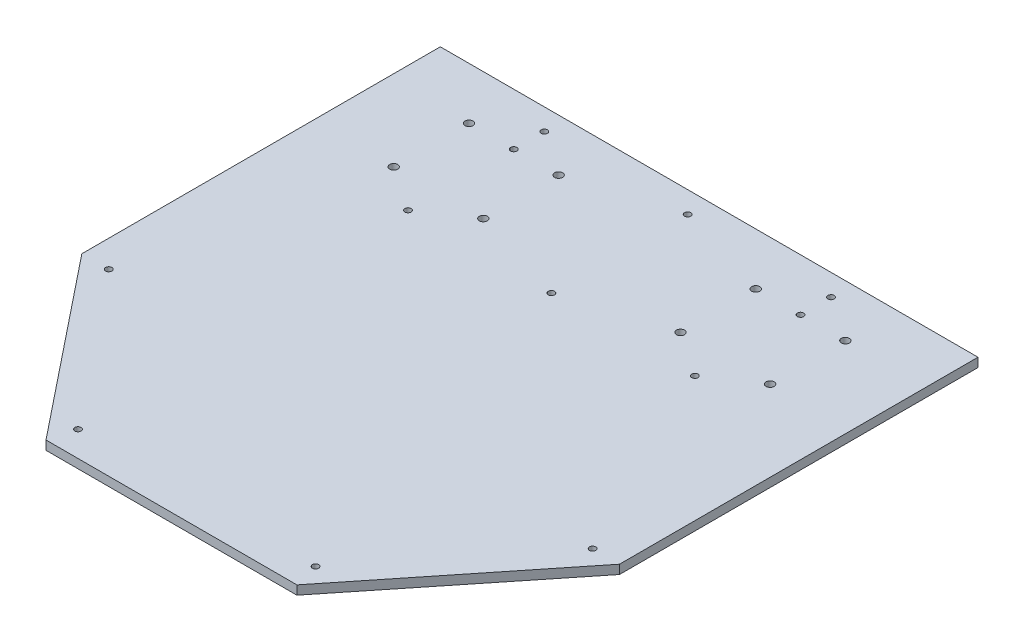
ISO-10303-21;
HEADER;
FILE_DESCRIPTION(('STEP AP214'),'2;1');
FILE_NAME('part.step','',(''),(''),'','','');
FILE_SCHEMA(('AUTOMOTIVE_DESIGN { 1 0 10303 214 1 1 1 1 }'));
ENDSEC;
DATA;
#1=APPLICATION_CONTEXT('core data for automotive mechanical design processes');
#2=APPLICATION_PROTOCOL_DEFINITION('international standard','automotive_design',2000,#1);
#3=PRODUCT_CONTEXT('',#1,'mechanical');
#4=PRODUCT('Part','Part','',(#3));
#5=PRODUCT_RELATED_PRODUCT_CATEGORY('part','',(#4));
#6=PRODUCT_DEFINITION_FORMATION('','',#4);
#7=PRODUCT_DEFINITION_CONTEXT('part definition',#1,'design');
#8=PRODUCT_DEFINITION('design','',#6,#7);
#9=PRODUCT_DEFINITION_SHAPE('','',#8);
#10=(LENGTH_UNIT() NAMED_UNIT(*) SI_UNIT(.MILLI.,.METRE.));
#11=(NAMED_UNIT(*) PLANE_ANGLE_UNIT() SI_UNIT($,.RADIAN.));
#12=(NAMED_UNIT(*) SI_UNIT($,.STERADIAN.) SOLID_ANGLE_UNIT());
#13=UNCERTAINTY_MEASURE_WITH_UNIT(LENGTH_MEASURE(1.E-05),#10,'distance_accuracy_value','');
#14=(GEOMETRIC_REPRESENTATION_CONTEXT(3) GLOBAL_UNCERTAINTY_ASSIGNED_CONTEXT((#13)) GLOBAL_UNIT_ASSIGNED_CONTEXT((#10,
#11,#12)) REPRESENTATION_CONTEXT('',''));
#15=CARTESIAN_POINT('',(0.,0.,0.));
#16=DIRECTION('',(0.,0.,1.));
#17=DIRECTION('',(1.,0.,0.));
#18=AXIS2_PLACEMENT_3D('',#15,#16,#17);
#19=CARTESIAN_POINT('',(0.,5.,0.));
#20=DIRECTION('',(0.,1.,0.));
#21=DIRECTION('',(0.,0.,1.));
#22=AXIS2_PLACEMENT_3D('',#19,#20,#21);
#23=PLANE('',#22);
#24=CARTESIAN_POINT('',(66.2835447690133,5.,135.895569038733));
#25=DIRECTION('',(0.,1.,0.));
#26=DIRECTION('',(0.,0.,-1.));
#27=AXIS2_PLACEMENT_3D('',#24,#25,#26);
#28=CIRCLE('',#27,1.75000000000001);
#29=CARTESIAN_POINT('',(66.2835447690133,5.,134.145569038733));
#30=VERTEX_POINT('',#29);
#31=EDGE_CURVE('E265',#30,#30,#28,.T.);
#32=ORIENTED_EDGE('',*,*,#31,.F.);
#33=EDGE_LOOP('',(#32));
#34=FACE_BOUND('',#33,.T.);
#35=CARTESIAN_POINT('',(135.,5.,49.9999999999999));
#36=DIRECTION('',(0.,1.,0.));
#37=DIRECTION('',(0.,0.,-1.));
#38=AXIS2_PLACEMENT_3D('',#35,#36,#37);
#39=CIRCLE('',#38,1.75000000000001);
#40=CARTESIAN_POINT('',(135.,5.,48.2499999999999));
#41=VERTEX_POINT('',#40);
#42=EDGE_CURVE('E257',#41,#41,#39,.T.);
#43=ORIENTED_EDGE('',*,*,#42,.F.);
#44=EDGE_LOOP('',(#43));
#45=FACE_BOUND('',#44,.T.);
#46=CARTESIAN_POINT('',(-66.2835447690133,5.,135.895569038733));
#47=DIRECTION('',(0.,1.,0.));
#48=DIRECTION('',(0.,0.,1.));
#49=AXIS2_PLACEMENT_3D('',#46,#47,#48);
#50=CIRCLE('',#49,1.75000000000001);
#51=CARTESIAN_POINT('',(-66.2835447690133,5.,137.645569038733));
#52=VERTEX_POINT('',#51);
#53=EDGE_CURVE('E250',#52,#52,#50,.T.);
#54=ORIENTED_EDGE('',*,*,#53,.F.);
#55=EDGE_LOOP('',(#54));
#56=FACE_BOUND('',#55,.T.);
#57=CARTESIAN_POINT('',(-135.,5.,50.));
#58=DIRECTION('',(0.,1.,0.));
#59=DIRECTION('',(0.,0.,1.));
#60=AXIS2_PLACEMENT_3D('',#57,#58,#59);
#61=CIRCLE('',#60,1.75000000000001);
#62=CARTESIAN_POINT('',(-135.,5.,51.75));
#63=VERTEX_POINT('',#62);
#64=EDGE_CURVE('E254',#63,#63,#61,.T.);
#65=ORIENTED_EDGE('',*,*,#64,.F.);
#66=EDGE_LOOP('',(#65));
#67=FACE_BOUND('',#66,.T.);
#68=CARTESIAN_POINT('',(80.,5.,-121.));
#69=DIRECTION('',(0.,1.,0.));
#70=DIRECTION('',(0.,0.,-1.));
#71=AXIS2_PLACEMENT_3D('',#68,#69,#70);
#72=CIRCLE('',#71,1.75);
#73=CARTESIAN_POINT('',(80.,5.,-122.75));
#74=VERTEX_POINT('',#73);
#75=EDGE_CURVE('E272',#74,#74,#72,.T.);
#76=ORIENTED_EDGE('',*,*,#75,.F.);
#77=EDGE_LOOP('',(#76));
#78=FACE_BOUND('',#77,.T.);
#79=CARTESIAN_POINT('',(-80.,5.,-121.));
#80=DIRECTION('',(0.,1.,0.));
#81=DIRECTION('',(0.,0.,1.));
#82=AXIS2_PLACEMENT_3D('',#79,#80,#81);
#83=CIRCLE('',#82,1.75);
#84=CARTESIAN_POINT('',(-80.,5.,-119.25));
#85=VERTEX_POINT('',#84);
#86=EDGE_CURVE('E271',#85,#85,#83,.T.);
#87=ORIENTED_EDGE('',*,*,#86,.F.);
#88=EDGE_LOOP('',(#87));
#89=FACE_BOUND('',#88,.T.);
#90=CARTESIAN_POINT('',(-80.,5.,-62.));
#91=DIRECTION('',(0.,1.,0.));
#92=DIRECTION('',(0.,0.,1.));
#93=AXIS2_PLACEMENT_3D('',#90,#91,#92);
#94=CIRCLE('',#93,1.75);
#95=CARTESIAN_POINT('',(-80.,5.,-60.25));
#96=VERTEX_POINT('',#95);
#97=EDGE_CURVE('E290',#96,#96,#94,.T.);
#98=ORIENTED_EDGE('',*,*,#97,.F.);
#99=EDGE_LOOP('',(#98));
#100=FACE_BOUND('',#99,.T.);
#101=CARTESIAN_POINT('',(80.,5.,-62.));
#102=DIRECTION('',(0.,1.,0.));
#103=DIRECTION('',(0.,0.,-1.));
#104=AXIS2_PLACEMENT_3D('',#101,#102,#103);
#105=CIRCLE('',#104,1.75);
#106=CARTESIAN_POINT('',(80.,5.,-63.75));
#107=VERTEX_POINT('',#106);
#108=EDGE_CURVE('E296',#107,#107,#105,.T.);
#109=ORIENTED_EDGE('',*,*,#108,.F.);
#110=EDGE_LOOP('',(#109));
#111=FACE_BOUND('',#110,.T.);
#112=CARTESIAN_POINT('',(80.,5.,-138.));
#113=DIRECTION('',(0.,1.,0.));
#114=DIRECTION('',(0.,0.,1.));
#115=AXIS2_PLACEMENT_3D('',#112,#113,#114);
#116=CIRCLE('',#115,1.75);
#117=CARTESIAN_POINT('',(80.,5.,-136.25));
#118=VERTEX_POINT('',#117);
#119=EDGE_CURVE('E302',#118,#118,#116,.T.);
#120=ORIENTED_EDGE('',*,*,#119,.F.);
#121=EDGE_LOOP('',(#120));
#122=FACE_BOUND('',#121,.T.);
#123=CARTESIAN_POINT('',(-80.,5.,-138.));
#124=DIRECTION('',(0.,1.,0.));
#125=DIRECTION('',(0.,0.,-1.));
#126=AXIS2_PLACEMENT_3D('',#123,#124,#125);
#127=CIRCLE('',#126,1.75);
#128=CARTESIAN_POINT('',(-80.,5.,-139.75));
#129=VERTEX_POINT('',#128);
#130=EDGE_CURVE('E308',#129,#129,#127,.T.);
#131=ORIENTED_EDGE('',*,*,#130,.F.);
#132=EDGE_LOOP('',(#131));
#133=FACE_BOUND('',#132,.T.);
#134=CARTESIAN_POINT('',(0.,5.,-138.));
#135=DIRECTION('',(0.,1.,0.));
#136=DIRECTION('',(0.,0.,-1.));
#137=AXIS2_PLACEMENT_3D('',#134,#135,#136);
#138=CIRCLE('',#137,1.75);
#139=CARTESIAN_POINT('',(0.,5.,-139.75));
#140=VERTEX_POINT('',#139);
#141=EDGE_CURVE('E283',#140,#140,#138,.T.);
#142=ORIENTED_EDGE('',*,*,#141,.F.);
#143=EDGE_LOOP('',(#142));
#144=FACE_BOUND('',#143,.T.);
#145=CARTESIAN_POINT('',(0.,5.,-62.));
#146=DIRECTION('',(0.,1.,0.));
#147=DIRECTION('',(0.,0.,1.));
#148=AXIS2_PLACEMENT_3D('',#145,#146,#147);
#149=CIRCLE('',#148,1.75);
#150=CARTESIAN_POINT('',(0.,5.,-60.25));
#151=VERTEX_POINT('',#150);
#152=EDGE_CURVE('E289',#151,#151,#149,.T.);
#153=ORIENTED_EDGE('',*,*,#152,.F.);
#154=EDGE_LOOP('',(#153));
#155=FACE_BOUND('',#154,.T.);
#156=CARTESIAN_POINT('',(105.,5.,-121.));
#157=DIRECTION('',(0.,1.,0.));
#158=DIRECTION('',(0.,0.,1.));
#159=AXIS2_PLACEMENT_3D('',#156,#157,#158);
#160=CIRCLE('',#159,2.25000000000001);
#161=CARTESIAN_POINT('',(105.,5.,-118.75));
#162=VERTEX_POINT('',#161);
#163=EDGE_CURVE('E328',#162,#162,#160,.T.);
#164=ORIENTED_EDGE('',*,*,#163,.F.);
#165=EDGE_LOOP('',(#164));
#166=FACE_BOUND('',#165,.T.);
#167=CARTESIAN_POINT('',(55.,5.,-121.));
#168=DIRECTION('',(0.,1.,0.));
#169=DIRECTION('',(0.,0.,1.));
#170=AXIS2_PLACEMENT_3D('',#167,#168,#169);
#171=CIRCLE('',#170,2.25);
#172=CARTESIAN_POINT('',(55.,5.,-118.75));
#173=VERTEX_POINT('',#172);
#174=EDGE_CURVE('E340',#173,#173,#171,.T.);
#175=ORIENTED_EDGE('',*,*,#174,.F.);
#176=EDGE_LOOP('',(#175));
#177=FACE_BOUND('',#176,.T.);
#178=CARTESIAN_POINT('',(-55.,5.,-79.));
#179=DIRECTION('',(0.,1.,0.));
#180=DIRECTION('',(0.,0.,1.));
#181=AXIS2_PLACEMENT_3D('',#178,#179,#180);
#182=CIRCLE('',#181,2.25);
#183=CARTESIAN_POINT('',(-55.,5.,-76.75));
#184=VERTEX_POINT('',#183);
#185=EDGE_CURVE('E352',#184,#184,#182,.T.);
#186=ORIENTED_EDGE('',*,*,#185,.F.);
#187=EDGE_LOOP('',(#186));
#188=FACE_BOUND('',#187,.T.);
#189=CARTESIAN_POINT('',(-105.,5.,-121.));
#190=DIRECTION('',(0.,1.,0.));
#191=DIRECTION('',(0.,0.,1.));
#192=AXIS2_PLACEMENT_3D('',#189,#190,#191);
#193=CIRCLE('',#192,2.25000000000001);
#194=CARTESIAN_POINT('',(-105.,5.,-118.75));
#195=VERTEX_POINT('',#194);
#196=EDGE_CURVE('E124',#195,#195,#193,.T.);
#197=ORIENTED_EDGE('',*,*,#196,.F.);
#198=EDGE_LOOP('',(#197));
#199=FACE_BOUND('',#198,.T.);
#200=DIRECTION('',(0.,0.,1.));
#201=VECTOR('',#200,1.);
#202=CARTESIAN_POINT('',(-150.,5.,-150.));
#203=LINE('',#202,#201);
#204=CARTESIAN_POINT('',(-150.,5.,-150.));
#205=VERTEX_POINT('',#204);
#206=CARTESIAN_POINT('',(-150.,5.,50.));
#207=VERTEX_POINT('',#206);
#208=EDGE_CURVE('E131',#205,#207,#203,.T.);
#209=ORIENTED_EDGE('',*,*,#208,.T.);
#210=DIRECTION('',(0.624695047554425,0.,0.78086880944303));
#211=VECTOR('',#210,1.);
#212=CARTESIAN_POINT('',(-150.,5.,50.));
#213=LINE('',#212,#211);
#214=CARTESIAN_POINT('',(-70.,5.,150.));
#215=VERTEX_POINT('',#214);
#216=EDGE_CURVE('E89',#207,#215,#213,.T.);
#217=ORIENTED_EDGE('',*,*,#216,.T.);
#218=DIRECTION('',(1.,0.,0.));
#219=VECTOR('',#218,1.);
#220=CARTESIAN_POINT('',(-70.,5.,150.));
#221=LINE('',#220,#219);
#222=CARTESIAN_POINT('',(70.,5.,150.));
#223=VERTEX_POINT('',#222);
#224=EDGE_CURVE('E102',#215,#223,#221,.T.);
#225=ORIENTED_EDGE('',*,*,#224,.T.);
#226=DIRECTION('',(0.624695047554424,0.,-0.78086880944303));
#227=VECTOR('',#226,1.);
#228=CARTESIAN_POINT('',(150.,5.,50.));
#229=LINE('',#228,#227);
#230=CARTESIAN_POINT('',(150.,5.,50.));
#231=VERTEX_POINT('',#230);
#232=EDGE_CURVE('E96',#223,#231,#229,.T.);
#233=ORIENTED_EDGE('',*,*,#232,.T.);
#234=DIRECTION('',(0.,0.,-1.));
#235=VECTOR('',#234,1.);
#236=CARTESIAN_POINT('',(150.,5.,-150.));
#237=LINE('',#236,#235);
#238=CARTESIAN_POINT('',(150.,5.,-150.));
#239=VERTEX_POINT('',#238);
#240=EDGE_CURVE('E100',#231,#239,#237,.T.);
#241=ORIENTED_EDGE('',*,*,#240,.T.);
#242=DIRECTION('',(-1.,0.,0.));
#243=VECTOR('',#242,1.);
#244=CARTESIAN_POINT('',(-150.,5.,-150.));
#245=LINE('',#244,#243);
#246=EDGE_CURVE('E52',#239,#205,#245,.T.);
#247=ORIENTED_EDGE('',*,*,#246,.T.);
#248=EDGE_LOOP('',(#209,#217,#225,#233,#241,#247));
#249=FACE_BOUND('',#248,.T.);
#250=CARTESIAN_POINT('',(-105.,5.,-79.));
#251=DIRECTION('',(0.,1.,0.));
#252=DIRECTION('',(0.,0.,1.));
#253=AXIS2_PLACEMENT_3D('',#250,#251,#252);
#254=CIRCLE('',#253,2.25000000000001);
#255=CARTESIAN_POINT('',(-105.,5.,-76.7499999999999));
#256=VERTEX_POINT('',#255);
#257=EDGE_CURVE('E358',#256,#256,#254,.T.);
#258=ORIENTED_EDGE('',*,*,#257,.F.);
#259=EDGE_LOOP('',(#258));
#260=FACE_BOUND('',#259,.T.);
#261=CARTESIAN_POINT('',(-55.,5.,-121.));
#262=DIRECTION('',(0.,1.,0.));
#263=DIRECTION('',(0.,0.,1.));
#264=AXIS2_PLACEMENT_3D('',#261,#262,#263);
#265=CIRCLE('',#264,2.25);
#266=CARTESIAN_POINT('',(-55.,5.,-118.75));
#267=VERTEX_POINT('',#266);
#268=EDGE_CURVE('E346',#267,#267,#265,.T.);
#269=ORIENTED_EDGE('',*,*,#268,.F.);
#270=EDGE_LOOP('',(#269));
#271=FACE_BOUND('',#270,.T.);
#272=CARTESIAN_POINT('',(55.,5.,-79.));
#273=DIRECTION('',(0.,1.,0.));
#274=DIRECTION('',(0.,0.,1.));
#275=AXIS2_PLACEMENT_3D('',#272,#273,#274);
#276=CIRCLE('',#275,2.25);
#277=CARTESIAN_POINT('',(55.,5.,-76.75));
#278=VERTEX_POINT('',#277);
#279=EDGE_CURVE('E334',#278,#278,#276,.T.);
#280=ORIENTED_EDGE('',*,*,#279,.F.);
#281=EDGE_LOOP('',(#280));
#282=FACE_BOUND('',#281,.T.);
#283=CARTESIAN_POINT('',(105.,5.,-79.));
#284=DIRECTION('',(0.,1.,0.));
#285=DIRECTION('',(0.,0.,1.));
#286=AXIS2_PLACEMENT_3D('',#283,#284,#285);
#287=CIRCLE('',#286,2.25000000000001);
#288=CARTESIAN_POINT('',(105.,5.,-76.75));
#289=VERTEX_POINT('',#288);
#290=EDGE_CURVE('E322',#289,#289,#287,.T.);
#291=ORIENTED_EDGE('',*,*,#290,.F.);
#292=EDGE_LOOP('',(#291));
#293=FACE_BOUND('',#292,.T.);
#294=ADVANCED_FACE('F35',(#34,#45,#56,#67,#78,#89,#100,#111,#122,#133,#144,#155,#166,#177,#188,
#199,#249,#260,#271,#282,#293),#23,.T.);
#295=CARTESIAN_POINT('',(0.,0.,0.));
#296=DIRECTION('',(0.,1.,0.));
#297=DIRECTION('',(0.,0.,1.));
#298=AXIS2_PLACEMENT_3D('',#295,#296,#297);
#299=PLANE('',#298);
#300=CARTESIAN_POINT('',(66.2835447690133,0.,135.895569038733));
#301=DIRECTION('',(0.,1.,0.));
#302=DIRECTION('',(0.,0.,-1.));
#303=AXIS2_PLACEMENT_3D('',#300,#301,#302);
#304=CIRCLE('',#303,1.75000000000001);
#305=CARTESIAN_POINT('',(66.2835447690133,0.,134.145569038733));
#306=VERTEX_POINT('',#305);
#307=EDGE_CURVE('E262',#306,#306,#304,.T.);
#308=ORIENTED_EDGE('',*,*,#307,.T.);
#309=EDGE_LOOP('',(#308));
#310=FACE_BOUND('',#309,.T.);
#311=CARTESIAN_POINT('',(135.,0.,49.9999999999999));
#312=DIRECTION('',(0.,1.,0.));
#313=DIRECTION('',(0.,0.,-1.));
#314=AXIS2_PLACEMENT_3D('',#311,#312,#313);
#315=CIRCLE('',#314,1.75000000000001);
#316=CARTESIAN_POINT('',(135.,0.,48.2499999999999));
#317=VERTEX_POINT('',#316);
#318=EDGE_CURVE('E252',#317,#317,#315,.T.);
#319=ORIENTED_EDGE('',*,*,#318,.T.);
#320=EDGE_LOOP('',(#319));
#321=FACE_BOUND('',#320,.T.);
#322=CARTESIAN_POINT('',(-66.2835447690133,0.,135.895569038733));
#323=DIRECTION('',(0.,1.,0.));
#324=DIRECTION('',(0.,0.,1.));
#325=AXIS2_PLACEMENT_3D('',#322,#323,#324);
#326=CIRCLE('',#325,1.75000000000001);
#327=CARTESIAN_POINT('',(-66.2835447690133,0.,137.645569038733));
#328=VERTEX_POINT('',#327);
#329=EDGE_CURVE('E247',#328,#328,#326,.T.);
#330=ORIENTED_EDGE('',*,*,#329,.T.);
#331=EDGE_LOOP('',(#330));
#332=FACE_BOUND('',#331,.T.);
#333=CARTESIAN_POINT('',(-135.,0.,50.));
#334=DIRECTION('',(0.,1.,0.));
#335=DIRECTION('',(0.,0.,1.));
#336=AXIS2_PLACEMENT_3D('',#333,#334,#335);
#337=CIRCLE('',#336,1.75000000000001);
#338=CARTESIAN_POINT('',(-135.,0.,51.75));
#339=VERTEX_POINT('',#338);
#340=EDGE_CURVE('E275',#339,#339,#337,.T.);
#341=ORIENTED_EDGE('',*,*,#340,.T.);
#342=EDGE_LOOP('',(#341));
#343=FACE_BOUND('',#342,.T.);
#344=CARTESIAN_POINT('',(80.,0.,-121.));
#345=DIRECTION('',(0.,1.,0.));
#346=DIRECTION('',(0.,0.,-1.));
#347=AXIS2_PLACEMENT_3D('',#344,#345,#346);
#348=CIRCLE('',#347,1.75);
#349=CARTESIAN_POINT('',(80.,0.,-122.75));
#350=VERTEX_POINT('',#349);
#351=EDGE_CURVE('E268',#350,#350,#348,.T.);
#352=ORIENTED_EDGE('',*,*,#351,.T.);
#353=EDGE_LOOP('',(#352));
#354=FACE_BOUND('',#353,.T.);
#355=CARTESIAN_POINT('',(-80.,0.,-121.));
#356=DIRECTION('',(0.,1.,0.));
#357=DIRECTION('',(0.,0.,1.));
#358=AXIS2_PLACEMENT_3D('',#355,#356,#357);
#359=CIRCLE('',#358,1.75);
#360=CARTESIAN_POINT('',(-80.,0.,-119.25));
#361=VERTEX_POINT('',#360);
#362=EDGE_CURVE('E280',#361,#361,#359,.T.);
#363=ORIENTED_EDGE('',*,*,#362,.T.);
#364=EDGE_LOOP('',(#363));
#365=FACE_BOUND('',#364,.T.);
#366=CARTESIAN_POINT('',(-80.,0.,-62.));
#367=DIRECTION('',(0.,1.,0.));
#368=DIRECTION('',(0.,0.,1.));
#369=AXIS2_PLACEMENT_3D('',#366,#367,#368);
#370=CIRCLE('',#369,1.75);
#371=CARTESIAN_POINT('',(-80.,0.,-60.25));
#372=VERTEX_POINT('',#371);
#373=EDGE_CURVE('E286',#372,#372,#370,.T.);
#374=ORIENTED_EDGE('',*,*,#373,.T.);
#375=EDGE_LOOP('',(#374));
#376=FACE_BOUND('',#375,.T.);
#377=CARTESIAN_POINT('',(80.,0.,-62.));
#378=DIRECTION('',(0.,1.,0.));
#379=DIRECTION('',(0.,0.,-1.));
#380=AXIS2_PLACEMENT_3D('',#377,#378,#379);
#381=CIRCLE('',#380,1.75);
#382=CARTESIAN_POINT('',(80.,0.,-63.75));
#383=VERTEX_POINT('',#382);
#384=EDGE_CURVE('E293',#383,#383,#381,.T.);
#385=ORIENTED_EDGE('',*,*,#384,.T.);
#386=EDGE_LOOP('',(#385));
#387=FACE_BOUND('',#386,.T.);
#388=CARTESIAN_POINT('',(80.,0.,-138.));
#389=DIRECTION('',(0.,1.,0.));
#390=DIRECTION('',(0.,0.,1.));
#391=AXIS2_PLACEMENT_3D('',#388,#389,#390);
#392=CIRCLE('',#391,1.75);
#393=CARTESIAN_POINT('',(80.,0.,-136.25));
#394=VERTEX_POINT('',#393);
#395=EDGE_CURVE('E299',#394,#394,#392,.T.);
#396=ORIENTED_EDGE('',*,*,#395,.T.);
#397=EDGE_LOOP('',(#396));
#398=FACE_BOUND('',#397,.T.);
#399=CARTESIAN_POINT('',(-80.,0.,-138.));
#400=DIRECTION('',(0.,1.,0.));
#401=DIRECTION('',(0.,0.,-1.));
#402=AXIS2_PLACEMENT_3D('',#399,#400,#401);
#403=CIRCLE('',#402,1.75);
#404=CARTESIAN_POINT('',(-80.,0.,-139.75));
#405=VERTEX_POINT('',#404);
#406=EDGE_CURVE('E305',#405,#405,#403,.T.);
#407=ORIENTED_EDGE('',*,*,#406,.T.);
#408=EDGE_LOOP('',(#407));
#409=FACE_BOUND('',#408,.T.);
#410=CARTESIAN_POINT('',(0.,0.,-138.));
#411=DIRECTION('',(0.,1.,0.));
#412=DIRECTION('',(0.,0.,-1.));
#413=AXIS2_PLACEMENT_3D('',#410,#411,#412);
#414=CIRCLE('',#413,1.75);
#415=CARTESIAN_POINT('',(0.,0.,-139.75));
#416=VERTEX_POINT('',#415);
#417=EDGE_CURVE('E311',#416,#416,#414,.T.);
#418=ORIENTED_EDGE('',*,*,#417,.T.);
#419=EDGE_LOOP('',(#418));
#420=FACE_BOUND('',#419,.T.);
#421=CARTESIAN_POINT('',(0.,0.,-62.));
#422=DIRECTION('',(0.,1.,0.));
#423=DIRECTION('',(0.,0.,1.));
#424=AXIS2_PLACEMENT_3D('',#421,#422,#423);
#425=CIRCLE('',#424,1.75);
#426=CARTESIAN_POINT('',(0.,0.,-60.25));
#427=VERTEX_POINT('',#426);
#428=EDGE_CURVE('E316',#427,#427,#425,.T.);
#429=ORIENTED_EDGE('',*,*,#428,.T.);
#430=EDGE_LOOP('',(#429));
#431=FACE_BOUND('',#430,.T.);
#432=DIRECTION('',(0.,0.,1.));
#433=VECTOR('',#432,1.);
#434=CARTESIAN_POINT('',(-150.,0.,-150.));
#435=LINE('',#434,#433);
#436=CARTESIAN_POINT('',(-150.,0.,-150.));
#437=VERTEX_POINT('',#436);
#438=CARTESIAN_POINT('',(-150.,0.,50.));
#439=VERTEX_POINT('',#438);
#440=EDGE_CURVE('E120',#437,#439,#435,.T.);
#441=ORIENTED_EDGE('',*,*,#440,.F.);
#442=DIRECTION('',(-1.,0.,0.));
#443=VECTOR('',#442,1.);
#444=CARTESIAN_POINT('',(-150.,0.,-150.));
#445=LINE('',#444,#443);
#446=CARTESIAN_POINT('',(150.,0.,-150.));
#447=VERTEX_POINT('',#446);
#448=EDGE_CURVE('E81',#447,#437,#445,.T.);
#449=ORIENTED_EDGE('',*,*,#448,.F.);
#450=DIRECTION('',(0.,0.,-1.));
#451=VECTOR('',#450,1.);
#452=CARTESIAN_POINT('',(150.,0.,-150.));
#453=LINE('',#452,#451);
#454=CARTESIAN_POINT('',(150.,0.,50.));
#455=VERTEX_POINT('',#454);
#456=EDGE_CURVE('E75',#455,#447,#453,.T.);
#457=ORIENTED_EDGE('',*,*,#456,.F.);
#458=DIRECTION('',(0.624695047554424,0.,-0.78086880944303));
#459=VECTOR('',#458,1.);
#460=CARTESIAN_POINT('',(150.,0.,50.));
#461=LINE('',#460,#459);
#462=CARTESIAN_POINT('',(70.,0.,150.));
#463=VERTEX_POINT('',#462);
#464=EDGE_CURVE('E110',#463,#455,#461,.T.);
#465=ORIENTED_EDGE('',*,*,#464,.F.);
#466=DIRECTION('',(1.,0.,0.));
#467=VECTOR('',#466,1.);
#468=CARTESIAN_POINT('',(-70.,0.,150.));
#469=LINE('',#468,#467);
#470=CARTESIAN_POINT('',(-70.,0.,150.));
#471=VERTEX_POINT('',#470);
#472=EDGE_CURVE('E126',#471,#463,#469,.T.);
#473=ORIENTED_EDGE('',*,*,#472,.F.);
#474=DIRECTION('',(0.624695047554425,0.,0.78086880944303));
#475=VECTOR('',#474,1.);
#476=CARTESIAN_POINT('',(-150.,0.,50.));
#477=LINE('',#476,#475);
#478=EDGE_CURVE('E123',#439,#471,#477,.T.);
#479=ORIENTED_EDGE('',*,*,#478,.F.);
#480=EDGE_LOOP('',(#441,#449,#457,#465,#473,#479));
#481=FACE_BOUND('',#480,.T.);
#482=CARTESIAN_POINT('',(-105.,0.,-121.));
#483=DIRECTION('',(0.,1.,0.));
#484=DIRECTION('',(0.,0.,1.));
#485=AXIS2_PLACEMENT_3D('',#482,#483,#484);
#486=CIRCLE('',#485,2.25000000000001);
#487=CARTESIAN_POINT('',(-105.,0.,-118.75));
#488=VERTEX_POINT('',#487);
#489=EDGE_CURVE('E361',#488,#488,#486,.T.);
#490=ORIENTED_EDGE('',*,*,#489,.T.);
#491=EDGE_LOOP('',(#490));
#492=FACE_BOUND('',#491,.T.);
#493=CARTESIAN_POINT('',(-105.,0.,-79.));
#494=DIRECTION('',(0.,1.,0.));
#495=DIRECTION('',(0.,0.,1.));
#496=AXIS2_PLACEMENT_3D('',#493,#494,#495);
#497=CIRCLE('',#496,2.25000000000001);
#498=CARTESIAN_POINT('',(-105.,0.,-76.7499999999999));
#499=VERTEX_POINT('',#498);
#500=EDGE_CURVE('E355',#499,#499,#497,.T.);
#501=ORIENTED_EDGE('',*,*,#500,.T.);
#502=EDGE_LOOP('',(#501));
#503=FACE_BOUND('',#502,.T.);
#504=CARTESIAN_POINT('',(-55.,0.,-79.));
#505=DIRECTION('',(0.,1.,0.));
#506=DIRECTION('',(0.,0.,1.));
#507=AXIS2_PLACEMENT_3D('',#504,#505,#506);
#508=CIRCLE('',#507,2.25);
#509=CARTESIAN_POINT('',(-55.,0.,-76.75));
#510=VERTEX_POINT('',#509);
#511=EDGE_CURVE('E349',#510,#510,#508,.T.);
#512=ORIENTED_EDGE('',*,*,#511,.T.);
#513=EDGE_LOOP('',(#512));
#514=FACE_BOUND('',#513,.T.);
#515=CARTESIAN_POINT('',(-55.,0.,-121.));
#516=DIRECTION('',(0.,1.,0.));
#517=DIRECTION('',(0.,0.,1.));
#518=AXIS2_PLACEMENT_3D('',#515,#516,#517);
#519=CIRCLE('',#518,2.25);
#520=CARTESIAN_POINT('',(-55.,0.,-118.75));
#521=VERTEX_POINT('',#520);
#522=EDGE_CURVE('E343',#521,#521,#519,.T.);
#523=ORIENTED_EDGE('',*,*,#522,.T.);
#524=EDGE_LOOP('',(#523));
#525=FACE_BOUND('',#524,.T.);
#526=CARTESIAN_POINT('',(55.,0.,-121.));
#527=DIRECTION('',(0.,1.,0.));
#528=DIRECTION('',(0.,0.,1.));
#529=AXIS2_PLACEMENT_3D('',#526,#527,#528);
#530=CIRCLE('',#529,2.25);
#531=CARTESIAN_POINT('',(55.,0.,-118.75));
#532=VERTEX_POINT('',#531);
#533=EDGE_CURVE('E337',#532,#532,#530,.T.);
#534=ORIENTED_EDGE('',*,*,#533,.T.);
#535=EDGE_LOOP('',(#534));
#536=FACE_BOUND('',#535,.T.);
#537=CARTESIAN_POINT('',(55.,0.,-79.));
#538=DIRECTION('',(0.,1.,0.));
#539=DIRECTION('',(0.,0.,1.));
#540=AXIS2_PLACEMENT_3D('',#537,#538,#539);
#541=CIRCLE('',#540,2.25);
#542=CARTESIAN_POINT('',(55.,0.,-76.75));
#543=VERTEX_POINT('',#542);
#544=EDGE_CURVE('E331',#543,#543,#541,.T.);
#545=ORIENTED_EDGE('',*,*,#544,.T.);
#546=EDGE_LOOP('',(#545));
#547=FACE_BOUND('',#546,.T.);
#548=CARTESIAN_POINT('',(105.,0.,-121.));
#549=DIRECTION('',(0.,1.,0.));
#550=DIRECTION('',(0.,0.,1.));
#551=AXIS2_PLACEMENT_3D('',#548,#549,#550);
#552=CIRCLE('',#551,2.25000000000001);
#553=CARTESIAN_POINT('',(105.,0.,-118.75));
#554=VERTEX_POINT('',#553);
#555=EDGE_CURVE('E325',#554,#554,#552,.T.);
#556=ORIENTED_EDGE('',*,*,#555,.T.);
#557=EDGE_LOOP('',(#556));
#558=FACE_BOUND('',#557,.T.);
#559=CARTESIAN_POINT('',(105.,0.,-79.));
#560=DIRECTION('',(0.,1.,0.));
#561=DIRECTION('',(0.,0.,1.));
#562=AXIS2_PLACEMENT_3D('',#559,#560,#561);
#563=CIRCLE('',#562,2.25000000000001);
#564=CARTESIAN_POINT('',(105.,0.,-76.75));
#565=VERTEX_POINT('',#564);
#566=EDGE_CURVE('E319',#565,#565,#563,.T.);
#567=ORIENTED_EDGE('',*,*,#566,.T.);
#568=EDGE_LOOP('',(#567));
#569=FACE_BOUND('',#568,.T.);
#570=ADVANCED_FACE('F140',(#310,#321,#332,#343,#354,#365,#376,#387,#398,#409,#420,#431,#481,
#492,#503,#514,#525,#536,#547,#558,#569),#299,.F.);
#571=CARTESIAN_POINT('',(-150.,5.,-150.));
#572=DIRECTION('',(1.,0.,0.));
#573=DIRECTION('',(0.,0.,-1.));
#574=AXIS2_PLACEMENT_3D('',#571,#572,#573);
#575=PLANE('',#574);
#576=ORIENTED_EDGE('',*,*,#440,.T.);
#577=DIRECTION('',(0.,-1.,0.));
#578=VECTOR('',#577,1.);
#579=CARTESIAN_POINT('',(-150.,5.,50.));
#580=LINE('',#579,#578);
#581=EDGE_CURVE('E11',#207,#439,#580,.T.);
#582=ORIENTED_EDGE('',*,*,#581,.F.);
#583=ORIENTED_EDGE('',*,*,#208,.F.);
#584=DIRECTION('',(0.,-1.,0.));
#585=VECTOR('',#584,1.);
#586=CARTESIAN_POINT('',(-150.,5.,-150.));
#587=LINE('',#586,#585);
#588=EDGE_CURVE('E116',#205,#437,#587,.T.);
#589=ORIENTED_EDGE('',*,*,#588,.T.);
#590=EDGE_LOOP('',(#576,#582,#583,#589));
#591=FACE_BOUND('',#590,.T.);
#592=ADVANCED_FACE('F37',(#591),#575,.F.);
#593=CARTESIAN_POINT('',(-150.,5.,50.));
#594=DIRECTION('',(0.78086880944303,0.,-0.624695047554425));
#595=DIRECTION('',(-0.624695047554425,0.,-0.78086880944303));
#596=AXIS2_PLACEMENT_3D('',#593,#594,#595);
#597=PLANE('',#596);
#598=ORIENTED_EDGE('',*,*,#478,.T.);
#599=DIRECTION('',(0.,-1.,0.));
#600=VECTOR('',#599,1.);
#601=CARTESIAN_POINT('',(-70.,5.,150.));
#602=LINE('',#601,#600);
#603=EDGE_CURVE('E44',#215,#471,#602,.T.);
#604=ORIENTED_EDGE('',*,*,#603,.F.);
#605=ORIENTED_EDGE('',*,*,#216,.F.);
#606=ORIENTED_EDGE('',*,*,#581,.T.);
#607=EDGE_LOOP('',(#598,#604,#605,#606));
#608=FACE_BOUND('',#607,.T.);
#609=ADVANCED_FACE('F584',(#608),#597,.F.);
#610=CARTESIAN_POINT('',(-70.,5.,150.));
#611=DIRECTION('',(0.,0.,-1.));
#612=DIRECTION('',(-1.,0.,0.));
#613=AXIS2_PLACEMENT_3D('',#610,#611,#612);
#614=PLANE('',#613);
#615=ORIENTED_EDGE('',*,*,#472,.T.);
#616=DIRECTION('',(0.,-1.,0.));
#617=VECTOR('',#616,1.);
#618=CARTESIAN_POINT('',(70.,5.,150.));
#619=LINE('',#618,#617);
#620=EDGE_CURVE('E111',#223,#463,#619,.T.);
#621=ORIENTED_EDGE('',*,*,#620,.F.);
#622=ORIENTED_EDGE('',*,*,#224,.F.);
#623=ORIENTED_EDGE('',*,*,#603,.T.);
#624=EDGE_LOOP('',(#615,#621,#622,#623));
#625=FACE_BOUND('',#624,.T.);
#626=ADVANCED_FACE('F137',(#625),#614,.F.);
#627=CARTESIAN_POINT('',(150.,5.,50.));
#628=DIRECTION('',(-0.78086880944303,0.,-0.624695047554424));
#629=DIRECTION('',(-0.624695047554424,0.,0.78086880944303));
#630=AXIS2_PLACEMENT_3D('',#627,#628,#629);
#631=PLANE('',#630);
#632=ORIENTED_EDGE('',*,*,#464,.T.);
#633=DIRECTION('',(0.,-1.,0.));
#634=VECTOR('',#633,1.);
#635=CARTESIAN_POINT('',(150.,5.,50.));
#636=LINE('',#635,#634);
#637=EDGE_CURVE('E107',#231,#455,#636,.T.);
#638=ORIENTED_EDGE('',*,*,#637,.F.);
#639=ORIENTED_EDGE('',*,*,#232,.F.);
#640=ORIENTED_EDGE('',*,*,#620,.T.);
#641=EDGE_LOOP('',(#632,#638,#639,#640));
#642=FACE_BOUND('',#641,.T.);
#643=ADVANCED_FACE('F108',(#642),#631,.F.);
#644=CARTESIAN_POINT('',(150.,5.,-150.));
#645=DIRECTION('',(-1.,0.,0.));
#646=DIRECTION('',(0.,0.,1.));
#647=AXIS2_PLACEMENT_3D('',#644,#645,#646);
#648=PLANE('',#647);
#649=ORIENTED_EDGE('',*,*,#456,.T.);
#650=DIRECTION('',(0.,-1.,0.));
#651=VECTOR('',#650,1.);
#652=CARTESIAN_POINT('',(150.,5.,-150.));
#653=LINE('',#652,#651);
#654=EDGE_CURVE('E112',#239,#447,#653,.T.);
#655=ORIENTED_EDGE('',*,*,#654,.F.);
#656=ORIENTED_EDGE('',*,*,#240,.F.);
#657=ORIENTED_EDGE('',*,*,#637,.T.);
#658=EDGE_LOOP('',(#649,#655,#656,#657));
#659=FACE_BOUND('',#658,.T.);
#660=ADVANCED_FACE('F114',(#659),#648,.F.);
#661=CARTESIAN_POINT('',(-150.,5.,-150.));
#662=DIRECTION('',(0.,0.,1.));
#663=DIRECTION('',(1.,0.,0.));
#664=AXIS2_PLACEMENT_3D('',#661,#662,#663);
#665=PLANE('',#664);
#666=ORIENTED_EDGE('',*,*,#448,.T.);
#667=ORIENTED_EDGE('',*,*,#588,.F.);
#668=ORIENTED_EDGE('',*,*,#246,.F.);
#669=ORIENTED_EDGE('',*,*,#654,.T.);
#670=EDGE_LOOP('',(#666,#667,#668,#669));
#671=FACE_BOUND('',#670,.T.);
#672=ADVANCED_FACE('F145',(#671),#665,.F.);
#673=CARTESIAN_POINT('',(-105.,5.,-121.));
#674=DIRECTION('',(0.,-1.,0.));
#675=DIRECTION('',(0.,0.,-1.));
#676=AXIS2_PLACEMENT_3D('',#673,#674,#675);
#677=CYLINDRICAL_SURFACE('',#676,2.25000000000001);
#678=ORIENTED_EDGE('',*,*,#196,.T.);
#679=EDGE_LOOP('',(#678));
#680=FACE_BOUND('',#679,.T.);
#681=ORIENTED_EDGE('',*,*,#489,.F.);
#682=EDGE_LOOP('',(#681));
#683=FACE_BOUND('',#682,.T.);
#684=ADVANCED_FACE('F147',(#680,#683),#677,.F.);
#685=CARTESIAN_POINT('',(-105.,5.,-79.));
#686=DIRECTION('',(0.,-1.,0.));
#687=DIRECTION('',(0.,0.,-1.));
#688=AXIS2_PLACEMENT_3D('',#685,#686,#687);
#689=CYLINDRICAL_SURFACE('',#688,2.25000000000001);
#690=ORIENTED_EDGE('',*,*,#257,.T.);
#691=EDGE_LOOP('',(#690));
#692=FACE_BOUND('',#691,.T.);
#693=ORIENTED_EDGE('',*,*,#500,.F.);
#694=EDGE_LOOP('',(#693));
#695=FACE_BOUND('',#694,.T.);
#696=ADVANCED_FACE('F153',(#692,#695),#689,.F.);
#697=CARTESIAN_POINT('',(-55.,5.,-79.));
#698=DIRECTION('',(0.,-1.,0.));
#699=DIRECTION('',(0.,0.,-1.));
#700=AXIS2_PLACEMENT_3D('',#697,#698,#699);
#701=CYLINDRICAL_SURFACE('',#700,2.25);
#702=ORIENTED_EDGE('',*,*,#185,.T.);
#703=EDGE_LOOP('',(#702));
#704=FACE_BOUND('',#703,.T.);
#705=ORIENTED_EDGE('',*,*,#511,.F.);
#706=EDGE_LOOP('',(#705));
#707=FACE_BOUND('',#706,.T.);
#708=ADVANCED_FACE('F170',(#704,#707),#701,.F.);
#709=CARTESIAN_POINT('',(-55.,5.,-121.));
#710=DIRECTION('',(0.,-1.,0.));
#711=DIRECTION('',(0.,0.,-1.));
#712=AXIS2_PLACEMENT_3D('',#709,#710,#711);
#713=CYLINDRICAL_SURFACE('',#712,2.25);
#714=ORIENTED_EDGE('',*,*,#268,.T.);
#715=EDGE_LOOP('',(#714));
#716=FACE_BOUND('',#715,.T.);
#717=ORIENTED_EDGE('',*,*,#522,.F.);
#718=EDGE_LOOP('',(#717));
#719=FACE_BOUND('',#718,.T.);
#720=ADVANCED_FACE('F174',(#716,#719),#713,.F.);
#721=CARTESIAN_POINT('',(55.,5.,-121.));
#722=DIRECTION('',(0.,-1.,0.));
#723=DIRECTION('',(0.,0.,-1.));
#724=AXIS2_PLACEMENT_3D('',#721,#722,#723);
#725=CYLINDRICAL_SURFACE('',#724,2.25);
#726=ORIENTED_EDGE('',*,*,#174,.T.);
#727=EDGE_LOOP('',(#726));
#728=FACE_BOUND('',#727,.T.);
#729=ORIENTED_EDGE('',*,*,#533,.F.);
#730=EDGE_LOOP('',(#729));
#731=FACE_BOUND('',#730,.T.);
#732=ADVANCED_FACE('F178',(#728,#731),#725,.F.);
#733=CARTESIAN_POINT('',(55.,5.,-79.));
#734=DIRECTION('',(0.,-1.,0.));
#735=DIRECTION('',(0.,0.,-1.));
#736=AXIS2_PLACEMENT_3D('',#733,#734,#735);
#737=CYLINDRICAL_SURFACE('',#736,2.25);
#738=ORIENTED_EDGE('',*,*,#279,.T.);
#739=EDGE_LOOP('',(#738));
#740=FACE_BOUND('',#739,.T.);
#741=ORIENTED_EDGE('',*,*,#544,.F.);
#742=EDGE_LOOP('',(#741));
#743=FACE_BOUND('',#742,.T.);
#744=ADVANCED_FACE('F182',(#740,#743),#737,.F.);
#745=CARTESIAN_POINT('',(105.,5.,-121.));
#746=DIRECTION('',(0.,-1.,0.));
#747=DIRECTION('',(0.,0.,-1.));
#748=AXIS2_PLACEMENT_3D('',#745,#746,#747);
#749=CYLINDRICAL_SURFACE('',#748,2.25000000000001);
#750=ORIENTED_EDGE('',*,*,#163,.T.);
#751=EDGE_LOOP('',(#750));
#752=FACE_BOUND('',#751,.T.);
#753=ORIENTED_EDGE('',*,*,#555,.F.);
#754=EDGE_LOOP('',(#753));
#755=FACE_BOUND('',#754,.T.);
#756=ADVANCED_FACE('F186',(#752,#755),#749,.F.);
#757=CARTESIAN_POINT('',(105.,5.,-79.));
#758=DIRECTION('',(0.,-1.,0.));
#759=DIRECTION('',(0.,0.,-1.));
#760=AXIS2_PLACEMENT_3D('',#757,#758,#759);
#761=CYLINDRICAL_SURFACE('',#760,2.25000000000001);
#762=ORIENTED_EDGE('',*,*,#290,.T.);
#763=EDGE_LOOP('',(#762));
#764=FACE_BOUND('',#763,.T.);
#765=ORIENTED_EDGE('',*,*,#566,.F.);
#766=EDGE_LOOP('',(#765));
#767=FACE_BOUND('',#766,.T.);
#768=ADVANCED_FACE('F190',(#764,#767),#761,.F.);
#769=CARTESIAN_POINT('',(0.,0.,-62.));
#770=DIRECTION('',(0.,1.,0.));
#771=DIRECTION('',(0.,0.,1.));
#772=AXIS2_PLACEMENT_3D('',#769,#770,#771);
#773=CYLINDRICAL_SURFACE('',#772,1.75);
#774=ORIENTED_EDGE('',*,*,#428,.F.);
#775=EDGE_LOOP('',(#774));
#776=FACE_BOUND('',#775,.T.);
#777=ORIENTED_EDGE('',*,*,#152,.T.);
#778=EDGE_LOOP('',(#777));
#779=FACE_BOUND('',#778,.T.);
#780=ADVANCED_FACE('F194',(#776,#779),#773,.F.);
#781=CARTESIAN_POINT('',(0.,0.,-138.));
#782=DIRECTION('',(0.,1.,0.));
#783=DIRECTION('',(0.,0.,1.));
#784=AXIS2_PLACEMENT_3D('',#781,#782,#783);
#785=CYLINDRICAL_SURFACE('',#784,1.75);
#786=ORIENTED_EDGE('',*,*,#417,.F.);
#787=EDGE_LOOP('',(#786));
#788=FACE_BOUND('',#787,.T.);
#789=ORIENTED_EDGE('',*,*,#141,.T.);
#790=EDGE_LOOP('',(#789));
#791=FACE_BOUND('',#790,.T.);
#792=ADVANCED_FACE('F198',(#788,#791),#785,.F.);
#793=CARTESIAN_POINT('',(-80.,0.,-138.));
#794=DIRECTION('',(0.,1.,0.));
#795=DIRECTION('',(0.,0.,1.));
#796=AXIS2_PLACEMENT_3D('',#793,#794,#795);
#797=CYLINDRICAL_SURFACE('',#796,1.75);
#798=ORIENTED_EDGE('',*,*,#406,.F.);
#799=EDGE_LOOP('',(#798));
#800=FACE_BOUND('',#799,.T.);
#801=ORIENTED_EDGE('',*,*,#130,.T.);
#802=EDGE_LOOP('',(#801));
#803=FACE_BOUND('',#802,.T.);
#804=ADVANCED_FACE('F202',(#800,#803),#797,.F.);
#805=CARTESIAN_POINT('',(80.,0.,-138.));
#806=DIRECTION('',(0.,1.,0.));
#807=DIRECTION('',(0.,0.,1.));
#808=AXIS2_PLACEMENT_3D('',#805,#806,#807);
#809=CYLINDRICAL_SURFACE('',#808,1.75);
#810=ORIENTED_EDGE('',*,*,#395,.F.);
#811=EDGE_LOOP('',(#810));
#812=FACE_BOUND('',#811,.T.);
#813=ORIENTED_EDGE('',*,*,#119,.T.);
#814=EDGE_LOOP('',(#813));
#815=FACE_BOUND('',#814,.T.);
#816=ADVANCED_FACE('F206',(#812,#815),#809,.F.);
#817=CARTESIAN_POINT('',(80.,0.,-62.));
#818=DIRECTION('',(0.,1.,0.));
#819=DIRECTION('',(0.,0.,1.));
#820=AXIS2_PLACEMENT_3D('',#817,#818,#819);
#821=CYLINDRICAL_SURFACE('',#820,1.75);
#822=ORIENTED_EDGE('',*,*,#384,.F.);
#823=EDGE_LOOP('',(#822));
#824=FACE_BOUND('',#823,.T.);
#825=ORIENTED_EDGE('',*,*,#108,.T.);
#826=EDGE_LOOP('',(#825));
#827=FACE_BOUND('',#826,.T.);
#828=ADVANCED_FACE('F210',(#824,#827),#821,.F.);
#829=CARTESIAN_POINT('',(-80.,0.,-62.));
#830=DIRECTION('',(0.,1.,0.));
#831=DIRECTION('',(0.,0.,1.));
#832=AXIS2_PLACEMENT_3D('',#829,#830,#831);
#833=CYLINDRICAL_SURFACE('',#832,1.75);
#834=ORIENTED_EDGE('',*,*,#373,.F.);
#835=EDGE_LOOP('',(#834));
#836=FACE_BOUND('',#835,.T.);
#837=ORIENTED_EDGE('',*,*,#97,.T.);
#838=EDGE_LOOP('',(#837));
#839=FACE_BOUND('',#838,.T.);
#840=ADVANCED_FACE('F214',(#836,#839),#833,.F.);
#841=CARTESIAN_POINT('',(-80.,0.,-121.));
#842=DIRECTION('',(0.,1.,0.));
#843=DIRECTION('',(0.,0.,1.));
#844=AXIS2_PLACEMENT_3D('',#841,#842,#843);
#845=CYLINDRICAL_SURFACE('',#844,1.75);
#846=ORIENTED_EDGE('',*,*,#362,.F.);
#847=EDGE_LOOP('',(#846));
#848=FACE_BOUND('',#847,.T.);
#849=ORIENTED_EDGE('',*,*,#86,.T.);
#850=EDGE_LOOP('',(#849));
#851=FACE_BOUND('',#850,.T.);
#852=ADVANCED_FACE('F218',(#848,#851),#845,.F.);
#853=CARTESIAN_POINT('',(80.,0.,-121.));
#854=DIRECTION('',(0.,1.,0.));
#855=DIRECTION('',(0.,0.,1.));
#856=AXIS2_PLACEMENT_3D('',#853,#854,#855);
#857=CYLINDRICAL_SURFACE('',#856,1.75);
#858=ORIENTED_EDGE('',*,*,#351,.F.);
#859=EDGE_LOOP('',(#858));
#860=FACE_BOUND('',#859,.T.);
#861=ORIENTED_EDGE('',*,*,#75,.T.);
#862=EDGE_LOOP('',(#861));
#863=FACE_BOUND('',#862,.T.);
#864=ADVANCED_FACE('F222',(#860,#863),#857,.F.);
#865=CARTESIAN_POINT('',(-135.,0.,50.));
#866=DIRECTION('',(0.,1.,0.));
#867=DIRECTION('',(0.,0.,1.));
#868=AXIS2_PLACEMENT_3D('',#865,#866,#867);
#869=CYLINDRICAL_SURFACE('',#868,1.75000000000001);
#870=ORIENTED_EDGE('',*,*,#340,.F.);
#871=EDGE_LOOP('',(#870));
#872=FACE_BOUND('',#871,.T.);
#873=ORIENTED_EDGE('',*,*,#64,.T.);
#874=EDGE_LOOP('',(#873));
#875=FACE_BOUND('',#874,.T.);
#876=ADVANCED_FACE('F224',(#872,#875),#869,.F.);
#877=CARTESIAN_POINT('',(-66.2835447690133,0.,135.895569038733));
#878=DIRECTION('',(0.,1.,0.));
#879=DIRECTION('',(0.,0.,1.));
#880=AXIS2_PLACEMENT_3D('',#877,#878,#879);
#881=CYLINDRICAL_SURFACE('',#880,1.75000000000001);
#882=ORIENTED_EDGE('',*,*,#329,.F.);
#883=EDGE_LOOP('',(#882));
#884=FACE_BOUND('',#883,.T.);
#885=ORIENTED_EDGE('',*,*,#53,.T.);
#886=EDGE_LOOP('',(#885));
#887=FACE_BOUND('',#886,.T.);
#888=ADVANCED_FACE('F227',(#884,#887),#881,.F.);
#889=CARTESIAN_POINT('',(135.,0.,49.9999999999999));
#890=DIRECTION('',(0.,1.,0.));
#891=DIRECTION('',(0.,0.,1.));
#892=AXIS2_PLACEMENT_3D('',#889,#890,#891);
#893=CYLINDRICAL_SURFACE('',#892,1.75000000000001);
#894=ORIENTED_EDGE('',*,*,#318,.F.);
#895=EDGE_LOOP('',(#894));
#896=FACE_BOUND('',#895,.T.);
#897=ORIENTED_EDGE('',*,*,#42,.T.);
#898=EDGE_LOOP('',(#897));
#899=FACE_BOUND('',#898,.T.);
#900=ADVANCED_FACE('F235',(#896,#899),#893,.F.);
#901=CARTESIAN_POINT('',(66.2835447690133,0.,135.895569038733));
#902=DIRECTION('',(0.,1.,0.));
#903=DIRECTION('',(0.,0.,1.));
#904=AXIS2_PLACEMENT_3D('',#901,#902,#903);
#905=CYLINDRICAL_SURFACE('',#904,1.75000000000001);
#906=ORIENTED_EDGE('',*,*,#307,.F.);
#907=EDGE_LOOP('',(#906));
#908=FACE_BOUND('',#907,.T.);
#909=ORIENTED_EDGE('',*,*,#31,.T.);
#910=EDGE_LOOP('',(#909));
#911=FACE_BOUND('',#910,.T.);
#912=ADVANCED_FACE('F232',(#908,#911),#905,.F.);
#913=CLOSED_SHELL('',(#294,#570,#592,#609,#626,#643,#660,#672,#684,#696,#708,#720,#732,#744,
#756,#768,#780,#792,#804,#816,#828,#840,#852,#864,#876,#888,#900,#912));
#914=MANIFOLD_SOLID_BREP('B2',#913);
#915=ADVANCED_BREP_SHAPE_REPRESENTATION('',(#18,#914),#14);
#916=SHAPE_DEFINITION_REPRESENTATION(#9,#915);
ENDSEC;
END-ISO-10303-21;
